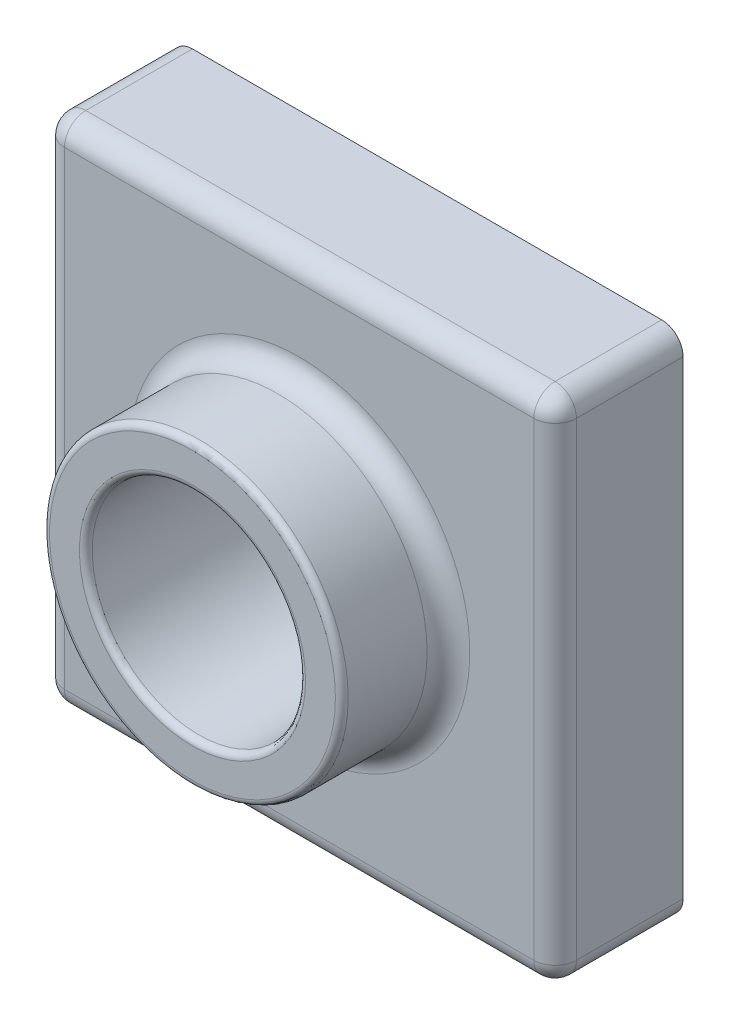
ISO-10303-21;
HEADER;
FILE_DESCRIPTION(('STEP AP214'),'2;1');
FILE_NAME('part.step','',(''),(''),'','','');
FILE_SCHEMA(('AUTOMOTIVE_DESIGN { 1 0 10303 214 1 1 1 1 }'));
ENDSEC;
DATA;
#1=APPLICATION_CONTEXT('core data for automotive mechanical design processes');
#2=APPLICATION_PROTOCOL_DEFINITION('international standard','automotive_design',2000,#1);
#3=PRODUCT_CONTEXT('',#1,'mechanical');
#4=PRODUCT('Part','Part','',(#3));
#5=PRODUCT_RELATED_PRODUCT_CATEGORY('part','',(#4));
#6=PRODUCT_DEFINITION_FORMATION('','',#4);
#7=PRODUCT_DEFINITION_CONTEXT('part definition',#1,'design');
#8=PRODUCT_DEFINITION('design','',#6,#7);
#9=PRODUCT_DEFINITION_SHAPE('','',#8);
#10=(LENGTH_UNIT() NAMED_UNIT(*) SI_UNIT(.MILLI.,.METRE.));
#11=(NAMED_UNIT(*) PLANE_ANGLE_UNIT() SI_UNIT($,.RADIAN.));
#12=(NAMED_UNIT(*) SI_UNIT($,.STERADIAN.) SOLID_ANGLE_UNIT());
#13=UNCERTAINTY_MEASURE_WITH_UNIT(LENGTH_MEASURE(1.E-05),#10,'distance_accuracy_value','');
#14=(GEOMETRIC_REPRESENTATION_CONTEXT(3) GLOBAL_UNCERTAINTY_ASSIGNED_CONTEXT((#13)) GLOBAL_UNIT_ASSIGNED_CONTEXT((#10,
#11,#12)) REPRESENTATION_CONTEXT('',''));
#15=CARTESIAN_POINT('',(0.,0.,0.));
#16=DIRECTION('',(0.,0.,1.));
#17=DIRECTION('',(1.,0.,0.));
#18=AXIS2_PLACEMENT_3D('',#15,#16,#17);
#19=CARTESIAN_POINT('',(0.,0.,0.));
#20=DIRECTION('',(0.,0.,-1.));
#21=DIRECTION('',(-1.,0.,0.));
#22=AXIS2_PLACEMENT_3D('',#19,#20,#21);
#23=PLANE('',#22);
#24=DIRECTION('',(1.,0.,0.));
#25=VECTOR('',#24,1.);
#26=CARTESIAN_POINT('',(-60.,-60.,0.));
#27=LINE('',#26,#25);
#28=CARTESIAN_POINT('',(-55.,-60.,0.));
#29=VERTEX_POINT('',#28);
#30=CARTESIAN_POINT('',(55.,-60.,0.));
#31=VERTEX_POINT('',#30);
#32=EDGE_CURVE('E256',#29,#31,#27,.T.);
#33=ORIENTED_EDGE('',*,*,#32,.F.);
#34=CARTESIAN_POINT('',(-55.,-55.,0.));
#35=DIRECTION('',(0.,0.,-1.));
#36=DIRECTION('',(-1.,0.,0.));
#37=AXIS2_PLACEMENT_3D('',#34,#35,#36);
#38=CIRCLE('',#37,5.);
#39=CARTESIAN_POINT('',(-60.,-55.,0.));
#40=VERTEX_POINT('',#39);
#41=EDGE_CURVE('E304',#29,#40,#38,.T.);
#42=ORIENTED_EDGE('',*,*,#41,.T.);
#43=DIRECTION('',(0.,-1.,0.));
#44=VECTOR('',#43,1.);
#45=CARTESIAN_POINT('',(-60.,-60.,0.));
#46=LINE('',#45,#44);
#47=CARTESIAN_POINT('',(-60.,55.,0.));
#48=VERTEX_POINT('',#47);
#49=EDGE_CURVE('E253',#48,#40,#46,.T.);
#50=ORIENTED_EDGE('',*,*,#49,.F.);
#51=CARTESIAN_POINT('',(-55.,55.,0.));
#52=DIRECTION('',(0.,0.,-1.));
#53=DIRECTION('',(-1.,0.,0.));
#54=AXIS2_PLACEMENT_3D('',#51,#52,#53);
#55=CIRCLE('',#54,5.);
#56=CARTESIAN_POINT('',(-55.,60.,0.));
#57=VERTEX_POINT('',#56);
#58=EDGE_CURVE('E298',#48,#57,#55,.T.);
#59=ORIENTED_EDGE('',*,*,#58,.T.);
#60=DIRECTION('',(-1.,0.,0.));
#61=VECTOR('',#60,1.);
#62=CARTESIAN_POINT('',(-60.,60.,0.));
#63=LINE('',#62,#61);
#64=CARTESIAN_POINT('',(55.,60.,0.));
#65=VERTEX_POINT('',#64);
#66=EDGE_CURVE('E250',#65,#57,#63,.T.);
#67=ORIENTED_EDGE('',*,*,#66,.F.);
#68=CARTESIAN_POINT('',(55.,55.,0.));
#69=DIRECTION('',(0.,0.,-1.));
#70=DIRECTION('',(-1.,0.,0.));
#71=AXIS2_PLACEMENT_3D('',#68,#69,#70);
#72=CIRCLE('',#71,5.);
#73=CARTESIAN_POINT('',(60.,55.,0.));
#74=VERTEX_POINT('',#73);
#75=EDGE_CURVE('E300',#65,#74,#72,.T.);
#76=ORIENTED_EDGE('',*,*,#75,.T.);
#77=DIRECTION('',(0.,1.,0.));
#78=VECTOR('',#77,1.);
#79=CARTESIAN_POINT('',(60.,-60.,0.));
#80=LINE('',#79,#78);
#81=CARTESIAN_POINT('',(60.,-55.,0.));
#82=VERTEX_POINT('',#81);
#83=EDGE_CURVE('E246',#82,#74,#80,.T.);
#84=ORIENTED_EDGE('',*,*,#83,.F.);
#85=CARTESIAN_POINT('',(55.,-55.,0.));
#86=DIRECTION('',(0.,0.,-1.));
#87=DIRECTION('',(-1.,0.,0.));
#88=AXIS2_PLACEMENT_3D('',#85,#86,#87);
#89=CIRCLE('',#88,5.);
#90=EDGE_CURVE('E302',#82,#31,#89,.T.);
#91=ORIENTED_EDGE('',*,*,#90,.T.);
#92=EDGE_LOOP('',(#33,#42,#50,#59,#67,#76,#84,#91));
#93=FACE_BOUND('',#92,.T.);
#94=CARTESIAN_POINT('',(-55.,-55.,0.));
#95=DIRECTION('',(0.,0.,-1.));
#96=DIRECTION('',(-1.,0.,0.));
#97=AXIS2_PLACEMENT_3D('',#94,#95,#96);
#98=CIRCLE('',#97,3.);
#99=CARTESIAN_POINT('',(-55.,-58.,0.));
#100=VERTEX_POINT('',#99);
#101=CARTESIAN_POINT('',(-58.,-55.,0.));
#102=VERTEX_POINT('',#101);
#103=EDGE_CURVE('E225',#100,#102,#98,.T.);
#104=ORIENTED_EDGE('',*,*,#103,.F.);
#105=DIRECTION('',(1.,0.,0.));
#106=VECTOR('',#105,1.);
#107=CARTESIAN_POINT('',(0.,-58.,0.));
#108=LINE('',#107,#106);
#109=CARTESIAN_POINT('',(55.,-58.,0.));
#110=VERTEX_POINT('',#109);
#111=EDGE_CURVE('E227',#100,#110,#108,.T.);
#112=ORIENTED_EDGE('',*,*,#111,.T.);
#113=CARTESIAN_POINT('',(55.,-55.,0.));
#114=DIRECTION('',(0.,0.,-1.));
#115=DIRECTION('',(-1.,0.,0.));
#116=AXIS2_PLACEMENT_3D('',#113,#114,#115);
#117=CIRCLE('',#116,3.);
#118=CARTESIAN_POINT('',(58.,-55.,0.));
#119=VERTEX_POINT('',#118);
#120=EDGE_CURVE('E223',#119,#110,#117,.T.);
#121=ORIENTED_EDGE('',*,*,#120,.F.);
#122=DIRECTION('',(0.,1.,0.));
#123=VECTOR('',#122,1.);
#124=CARTESIAN_POINT('',(58.,0.,0.));
#125=LINE('',#124,#123);
#126=CARTESIAN_POINT('',(58.,55.,0.));
#127=VERTEX_POINT('',#126);
#128=EDGE_CURVE('E48',#119,#127,#125,.T.);
#129=ORIENTED_EDGE('',*,*,#128,.T.);
#130=CARTESIAN_POINT('',(55.,55.,0.));
#131=DIRECTION('',(0.,0.,-1.));
#132=DIRECTION('',(-1.,0.,0.));
#133=AXIS2_PLACEMENT_3D('',#130,#131,#132);
#134=CIRCLE('',#133,3.);
#135=CARTESIAN_POINT('',(55.,58.,0.));
#136=VERTEX_POINT('',#135);
#137=EDGE_CURVE('E226',#136,#127,#134,.T.);
#138=ORIENTED_EDGE('',*,*,#137,.F.);
#139=DIRECTION('',(-1.,0.,0.));
#140=VECTOR('',#139,1.);
#141=CARTESIAN_POINT('',(0.,58.,0.));
#142=LINE('',#141,#140);
#143=CARTESIAN_POINT('',(-55.,58.,0.));
#144=VERTEX_POINT('',#143);
#145=EDGE_CURVE('E221',#136,#144,#142,.T.);
#146=ORIENTED_EDGE('',*,*,#145,.T.);
#147=CARTESIAN_POINT('',(-55.,55.,0.));
#148=DIRECTION('',(0.,0.,-1.));
#149=DIRECTION('',(-1.,0.,0.));
#150=AXIS2_PLACEMENT_3D('',#147,#148,#149);
#151=CIRCLE('',#150,3.);
#152=CARTESIAN_POINT('',(-58.,55.,0.));
#153=VERTEX_POINT('',#152);
#154=EDGE_CURVE('E187',#153,#144,#151,.T.);
#155=ORIENTED_EDGE('',*,*,#154,.F.);
#156=DIRECTION('',(0.,-1.,0.));
#157=VECTOR('',#156,1.);
#158=CARTESIAN_POINT('',(-58.,0.,0.));
#159=LINE('',#158,#157);
#160=EDGE_CURVE('E231',#153,#102,#159,.T.);
#161=ORIENTED_EDGE('',*,*,#160,.T.);
#162=EDGE_LOOP('',(#104,#112,#121,#129,#138,#146,#155,#161));
#163=FACE_BOUND('',#162,.T.);
#164=ADVANCED_FACE('F33',(#93,#163),#23,.T.);
#165=CARTESIAN_POINT('',(60.,-60.,30.));
#166=DIRECTION('',(-1.,0.,0.));
#167=DIRECTION('',(0.,0.,1.));
#168=AXIS2_PLACEMENT_3D('',#165,#166,#167);
#169=PLANE('',#168);
#170=DIRECTION('',(0.,1.,0.));
#171=VECTOR('',#170,1.);
#172=CARTESIAN_POINT('',(60.,-60.,25.));
#173=LINE('',#172,#171);
#174=CARTESIAN_POINT('',(60.,55.,25.));
#175=VERTEX_POINT('',#174);
#176=CARTESIAN_POINT('',(60.,-55.,25.));
#177=VERTEX_POINT('',#176);
#178=EDGE_CURVE('E56',#175,#177,#173,.F.);
#179=ORIENTED_EDGE('',*,*,#178,.T.);
#180=DIRECTION('',(0.,0.,-1.));
#181=VECTOR('',#180,1.);
#182=CARTESIAN_POINT('',(60.,-55.,30.));
#183=LINE('',#182,#181);
#184=EDGE_CURVE('E296',#177,#82,#183,.T.);
#185=ORIENTED_EDGE('',*,*,#184,.T.);
#186=ORIENTED_EDGE('',*,*,#83,.T.);
#187=DIRECTION('',(0.,0.,-1.));
#188=VECTOR('',#187,1.);
#189=CARTESIAN_POINT('',(60.,55.,30.));
#190=LINE('',#189,#188);
#191=EDGE_CURVE('E293',#74,#175,#190,.F.);
#192=ORIENTED_EDGE('',*,*,#191,.T.);
#193=EDGE_LOOP('',(#179,#185,#186,#192));
#194=FACE_BOUND('',#193,.T.);
#195=ADVANCED_FACE('F390',(#194),#169,.F.);
#196=CARTESIAN_POINT('',(-60.,60.,30.));
#197=DIRECTION('',(0.,-1.,0.));
#198=DIRECTION('',(0.,0.,-1.));
#199=AXIS2_PLACEMENT_3D('',#196,#197,#198);
#200=PLANE('',#199);
#201=DIRECTION('',(-1.,0.,0.));
#202=VECTOR('',#201,1.);
#203=CARTESIAN_POINT('',(-60.,60.,25.));
#204=LINE('',#203,#202);
#205=CARTESIAN_POINT('',(-55.,60.,25.));
#206=VERTEX_POINT('',#205);
#207=CARTESIAN_POINT('',(55.,60.,25.));
#208=VERTEX_POINT('',#207);
#209=EDGE_CURVE('E289',#206,#208,#204,.F.);
#210=ORIENTED_EDGE('',*,*,#209,.T.);
#211=DIRECTION('',(0.,0.,-1.));
#212=VECTOR('',#211,1.);
#213=CARTESIAN_POINT('',(55.,60.,30.));
#214=LINE('',#213,#212);
#215=EDGE_CURVE('E291',#208,#65,#214,.T.);
#216=ORIENTED_EDGE('',*,*,#215,.T.);
#217=ORIENTED_EDGE('',*,*,#66,.T.);
#218=DIRECTION('',(0.,0.,-1.));
#219=VECTOR('',#218,1.);
#220=CARTESIAN_POINT('',(-55.,60.,30.));
#221=LINE('',#220,#219);
#222=EDGE_CURVE('E287',#57,#206,#221,.F.);
#223=ORIENTED_EDGE('',*,*,#222,.T.);
#224=EDGE_LOOP('',(#210,#216,#217,#223));
#225=FACE_BOUND('',#224,.T.);
#226=ADVANCED_FACE('F395',(#225),#200,.F.);
#227=CARTESIAN_POINT('',(-60.,-60.,30.));
#228=DIRECTION('',(1.,0.,0.));
#229=DIRECTION('',(0.,0.,-1.));
#230=AXIS2_PLACEMENT_3D('',#227,#228,#229);
#231=PLANE('',#230);
#232=ORIENTED_EDGE('',*,*,#49,.T.);
#233=DIRECTION('',(0.,0.,-1.));
#234=VECTOR('',#233,1.);
#235=CARTESIAN_POINT('',(-60.,-55.,30.));
#236=LINE('',#235,#234);
#237=CARTESIAN_POINT('',(-60.,-55.,25.));
#238=VERTEX_POINT('',#237);
#239=EDGE_CURVE('E285',#40,#238,#236,.F.);
#240=ORIENTED_EDGE('',*,*,#239,.T.);
#241=DIRECTION('',(0.,-1.,0.));
#242=VECTOR('',#241,1.);
#243=CARTESIAN_POINT('',(-60.,-60.,25.));
#244=LINE('',#243,#242);
#245=CARTESIAN_POINT('',(-60.,55.,25.));
#246=VERTEX_POINT('',#245);
#247=EDGE_CURVE('E283',#238,#246,#244,.F.);
#248=ORIENTED_EDGE('',*,*,#247,.T.);
#249=DIRECTION('',(0.,0.,-1.));
#250=VECTOR('',#249,1.);
#251=CARTESIAN_POINT('',(-60.,55.,30.));
#252=LINE('',#251,#250);
#253=EDGE_CURVE('E281',#246,#48,#252,.T.);
#254=ORIENTED_EDGE('',*,*,#253,.T.);
#255=EDGE_LOOP('',(#232,#240,#248,#254));
#256=FACE_BOUND('',#255,.T.);
#257=ADVANCED_FACE('F812',(#256),#231,.F.);
#258=CARTESIAN_POINT('',(-60.,-60.,30.));
#259=DIRECTION('',(0.,1.,0.));
#260=DIRECTION('',(0.,0.,1.));
#261=AXIS2_PLACEMENT_3D('',#258,#259,#260);
#262=PLANE('',#261);
#263=DIRECTION('',(1.,0.,0.));
#264=VECTOR('',#263,1.);
#265=CARTESIAN_POINT('',(-60.,-60.,25.));
#266=LINE('',#265,#264);
#267=CARTESIAN_POINT('',(55.,-60.,25.));
#268=VERTEX_POINT('',#267);
#269=CARTESIAN_POINT('',(-55.,-60.,25.));
#270=VERTEX_POINT('',#269);
#271=EDGE_CURVE('E276',#268,#270,#266,.F.);
#272=ORIENTED_EDGE('',*,*,#271,.T.);
#273=DIRECTION('',(0.,0.,-1.));
#274=VECTOR('',#273,1.);
#275=CARTESIAN_POINT('',(-55.,-60.,30.));
#276=LINE('',#275,#274);
#277=EDGE_CURVE('E279',#270,#29,#276,.T.);
#278=ORIENTED_EDGE('',*,*,#277,.T.);
#279=ORIENTED_EDGE('',*,*,#32,.T.);
#280=DIRECTION('',(0.,0.,-1.));
#281=VECTOR('',#280,1.);
#282=CARTESIAN_POINT('',(55.,-60.,30.));
#283=LINE('',#282,#281);
#284=EDGE_CURVE('E274',#31,#268,#283,.F.);
#285=ORIENTED_EDGE('',*,*,#284,.T.);
#286=EDGE_LOOP('',(#272,#278,#279,#285));
#287=FACE_BOUND('',#286,.T.);
#288=ADVANCED_FACE('F384',(#287),#262,.F.);
#289=CARTESIAN_POINT('',(0.,0.,30.));
#290=DIRECTION('',(0.,0.,-1.));
#291=DIRECTION('',(-1.,0.,0.));
#292=AXIS2_PLACEMENT_3D('',#289,#290,#291);
#293=PLANE('',#292);
#294=CARTESIAN_POINT('',(0.,0.,30.));
#295=DIRECTION('',(0.,0.,-1.));
#296=DIRECTION('',(-1.,0.,0.));
#297=AXIS2_PLACEMENT_3D('',#294,#295,#296);
#298=CIRCLE('',#297,40.);
#299=CARTESIAN_POINT('',(-40.,0.,30.));
#300=VERTEX_POINT('',#299);
#301=EDGE_CURVE('E271',#300,#300,#298,.T.);
#302=ORIENTED_EDGE('',*,*,#301,.T.);
#303=EDGE_LOOP('',(#302));
#304=FACE_BOUND('',#303,.T.);
#305=DIRECTION('',(0.,-1.,0.));
#306=VECTOR('',#305,1.);
#307=CARTESIAN_POINT('',(-55.,0.,30.));
#308=LINE('',#307,#306);
#309=CARTESIAN_POINT('',(-55.,55.,30.));
#310=VERTEX_POINT('',#309);
#311=CARTESIAN_POINT('',(-55.,-55.,30.));
#312=VERTEX_POINT('',#311);
#313=EDGE_CURVE('E266',#310,#312,#308,.T.);
#314=ORIENTED_EDGE('',*,*,#313,.T.);
#315=DIRECTION('',(1.,0.,0.));
#316=VECTOR('',#315,1.);
#317=CARTESIAN_POINT('',(0.,-55.,30.));
#318=LINE('',#317,#316);
#319=CARTESIAN_POINT('',(55.,-55.,30.));
#320=VERTEX_POINT('',#319);
#321=EDGE_CURVE('E268',#312,#320,#318,.T.);
#322=ORIENTED_EDGE('',*,*,#321,.T.);
#323=DIRECTION('',(0.,1.,0.));
#324=VECTOR('',#323,1.);
#325=CARTESIAN_POINT('',(55.,0.,30.));
#326=LINE('',#325,#324);
#327=CARTESIAN_POINT('',(55.,55.,30.));
#328=VERTEX_POINT('',#327);
#329=EDGE_CURVE('E262',#320,#328,#326,.T.);
#330=ORIENTED_EDGE('',*,*,#329,.T.);
#331=DIRECTION('',(-1.,0.,0.));
#332=VECTOR('',#331,1.);
#333=CARTESIAN_POINT('',(0.,55.,30.));
#334=LINE('',#333,#332);
#335=EDGE_CURVE('E264',#328,#310,#334,.T.);
#336=ORIENTED_EDGE('',*,*,#335,.T.);
#337=EDGE_LOOP('',(#314,#322,#330,#336));
#338=FACE_BOUND('',#337,.T.);
#339=ADVANCED_FACE('F376',(#304,#338),#293,.F.);
#340=CARTESIAN_POINT('',(0.,0.,0.));
#341=DIRECTION('',(0.,0.,-1.));
#342=DIRECTION('',(-1.,0.,0.));
#343=AXIS2_PLACEMENT_3D('',#340,#341,#342);
#344=CIRCLE('',#343,27.);
#345=CARTESIAN_POINT('',(-27.,0.,0.));
#346=VERTEX_POINT('',#345);
#347=EDGE_CURVE('E222',#346,#346,#344,.F.);
#348=ORIENTED_EDGE('',*,*,#347,.F.);
#349=EDGE_LOOP('',(#348));
#350=FACE_BOUND('',#349,.T.);
#351=CARTESIAN_POINT('',(0.,0.,0.));
#352=DIRECTION('',(0.,0.,1.));
#353=DIRECTION('',(1.,0.,0.));
#354=AXIS2_PLACEMENT_3D('',#351,#352,#353);
#355=CIRCLE('',#354,25.);
#356=CARTESIAN_POINT('',(25.,0.,0.));
#357=VERTEX_POINT('',#356);
#358=EDGE_CURVE('E243',#357,#357,#355,.T.);
#359=ORIENTED_EDGE('',*,*,#358,.T.);
#360=EDGE_LOOP('',(#359));
#361=FACE_BOUND('',#360,.T.);
#362=ADVANCED_FACE('F374',(#350,#361),#23,.T.);
#363=CARTESIAN_POINT('',(0.,0.,55.));
#364=DIRECTION('',(0.,0.,-1.));
#365=DIRECTION('',(-1.,0.,0.));
#366=AXIS2_PLACEMENT_3D('',#363,#364,#365);
#367=CYLINDRICAL_SURFACE('',#366,35.);
#368=CARTESIAN_POINT('',(0.,0.,53.5));
#369=DIRECTION('',(0.,0.,1.));
#370=DIRECTION('',(1.,0.,0.));
#371=AXIS2_PLACEMENT_3D('',#368,#369,#370);
#372=CIRCLE('',#371,35.);
#373=CARTESIAN_POINT('',(35.,0.,53.5));
#374=VERTEX_POINT('',#373);
#375=EDGE_CURVE('E41',#374,#374,#372,.F.);
#376=ORIENTED_EDGE('',*,*,#375,.T.);
#377=EDGE_LOOP('',(#376));
#378=FACE_BOUND('',#377,.T.);
#379=CARTESIAN_POINT('',(0.,0.,35.));
#380=DIRECTION('',(0.,0.,-1.));
#381=DIRECTION('',(-1.,0.,0.));
#382=AXIS2_PLACEMENT_3D('',#379,#380,#381);
#383=CIRCLE('',#382,35.);
#384=CARTESIAN_POINT('',(-35.,0.,35.));
#385=VERTEX_POINT('',#384);
#386=EDGE_CURVE('E259',#385,#385,#383,.F.);
#387=ORIENTED_EDGE('',*,*,#386,.T.);
#388=EDGE_LOOP('',(#387));
#389=FACE_BOUND('',#388,.T.);
#390=ADVANCED_FACE('F348',(#378,#389),#367,.T.);
#391=CARTESIAN_POINT('',(0.,0.,55.));
#392=DIRECTION('',(0.,0.,1.));
#393=DIRECTION('',(1.,0.,0.));
#394=AXIS2_PLACEMENT_3D('',#391,#392,#393);
#395=PLANE('',#394);
#396=CARTESIAN_POINT('',(0.,0.,55.));
#397=DIRECTION('',(0.,0.,1.));
#398=DIRECTION('',(1.,0.,0.));
#399=AXIS2_PLACEMENT_3D('',#396,#397,#398);
#400=CIRCLE('',#399,33.5);
#401=CARTESIAN_POINT('',(33.5,0.,55.));
#402=VERTEX_POINT('',#401);
#403=EDGE_CURVE('E343',#402,#402,#400,.T.);
#404=ORIENTED_EDGE('',*,*,#403,.T.);
#405=EDGE_LOOP('',(#404));
#406=FACE_BOUND('',#405,.T.);
#407=CARTESIAN_POINT('',(0.,0.,55.));
#408=DIRECTION('',(0.,0.,1.));
#409=DIRECTION('',(1.,0.,0.));
#410=AXIS2_PLACEMENT_3D('',#407,#408,#409);
#411=CIRCLE('',#410,26.5);
#412=CARTESIAN_POINT('',(26.5,0.,55.));
#413=VERTEX_POINT('',#412);
#414=EDGE_CURVE('E306',#413,#413,#411,.F.);
#415=ORIENTED_EDGE('',*,*,#414,.T.);
#416=EDGE_LOOP('',(#415));
#417=FACE_BOUND('',#416,.T.);
#418=ADVANCED_FACE('F357',(#406,#417),#395,.T.);
#419=CARTESIAN_POINT('',(0.,0.,0.));
#420=DIRECTION('',(0.,0.,1.));
#421=DIRECTION('',(1.,0.,0.));
#422=AXIS2_PLACEMENT_3D('',#419,#420,#421);
#423=CYLINDRICAL_SURFACE('',#422,25.);
#424=CARTESIAN_POINT('',(0.,0.,53.5));
#425=DIRECTION('',(0.,0.,1.));
#426=DIRECTION('',(1.,0.,0.));
#427=AXIS2_PLACEMENT_3D('',#424,#425,#426);
#428=CIRCLE('',#427,25.);
#429=CARTESIAN_POINT('',(25.,0.,53.5));
#430=VERTEX_POINT('',#429);
#431=EDGE_CURVE('E11',#430,#430,#428,.T.);
#432=ORIENTED_EDGE('',*,*,#431,.T.);
#433=EDGE_LOOP('',(#432));
#434=FACE_BOUND('',#433,.T.);
#435=ORIENTED_EDGE('',*,*,#358,.F.);
#436=EDGE_LOOP('',(#435));
#437=FACE_BOUND('',#436,.T.);
#438=ADVANCED_FACE('F360',(#434,#437),#423,.F.);
#439=CARTESIAN_POINT('',(0.,0.,35.));
#440=DIRECTION('',(0.,0.,-1.));
#441=DIRECTION('',(-1.,0.,0.));
#442=AXIS2_PLACEMENT_3D('',#439,#440,#441);
#443=TOROIDAL_SURFACE('',#442,40.,5.);
#444=ORIENTED_EDGE('',*,*,#301,.F.);
#445=EDGE_LOOP('',(#444));
#446=FACE_BOUND('',#445,.T.);
#447=ORIENTED_EDGE('',*,*,#386,.F.);
#448=EDGE_LOOP('',(#447));
#449=FACE_BOUND('',#448,.T.);
#450=ADVANCED_FACE('F370',(#446,#449),#443,.F.);
#451=CARTESIAN_POINT('',(-55.,55.,30.));
#452=DIRECTION('',(0.,0.,-1.));
#453=DIRECTION('',(-1.,0.,0.));
#454=AXIS2_PLACEMENT_3D('',#451,#452,#453);
#455=CYLINDRICAL_SURFACE('',#454,5.);
#456=ORIENTED_EDGE('',*,*,#58,.F.);
#457=ORIENTED_EDGE('',*,*,#253,.F.);
#458=CARTESIAN_POINT('',(-55.,55.,25.));
#459=DIRECTION('',(0.,0.,1.));
#460=DIRECTION('',(1.,0.,0.));
#461=AXIS2_PLACEMENT_3D('',#458,#459,#460);
#462=CIRCLE('',#461,5.);
#463=EDGE_CURVE('E247',#206,#246,#462,.T.);
#464=ORIENTED_EDGE('',*,*,#463,.F.);
#465=ORIENTED_EDGE('',*,*,#222,.F.);
#466=EDGE_LOOP('',(#456,#457,#464,#465));
#467=FACE_BOUND('',#466,.T.);
#468=ADVANCED_FACE('F781',(#467),#455,.T.);
#469=CARTESIAN_POINT('',(0.,55.,25.));
#470=DIRECTION('',(-1.,0.,0.));
#471=DIRECTION('',(0.,0.,1.));
#472=AXIS2_PLACEMENT_3D('',#469,#470,#471);
#473=CYLINDRICAL_SURFACE('',#472,5.);
#474=CARTESIAN_POINT('',(55.,55.,25.));
#475=DIRECTION('',(1.,0.,0.));
#476=DIRECTION('',(0.,0.,-1.));
#477=AXIS2_PLACEMENT_3D('',#474,#475,#476);
#478=CIRCLE('',#477,5.);
#479=EDGE_CURVE('E333',#208,#328,#478,.T.);
#480=ORIENTED_EDGE('',*,*,#479,.F.);
#481=ORIENTED_EDGE('',*,*,#209,.F.);
#482=CARTESIAN_POINT('',(-55.,55.,25.));
#483=DIRECTION('',(-1.,0.,0.));
#484=DIRECTION('',(0.,0.,1.));
#485=AXIS2_PLACEMENT_3D('',#482,#483,#484);
#486=CIRCLE('',#485,5.);
#487=EDGE_CURVE('E336',#310,#206,#486,.T.);
#488=ORIENTED_EDGE('',*,*,#487,.F.);
#489=ORIENTED_EDGE('',*,*,#335,.F.);
#490=EDGE_LOOP('',(#480,#481,#488,#489));
#491=FACE_BOUND('',#490,.T.);
#492=ADVANCED_FACE('F771',(#491),#473,.T.);
#493=CARTESIAN_POINT('',(55.,55.,30.));
#494=DIRECTION('',(0.,0.,-1.));
#495=DIRECTION('',(-1.,0.,0.));
#496=AXIS2_PLACEMENT_3D('',#493,#494,#495);
#497=CYLINDRICAL_SURFACE('',#496,5.);
#498=ORIENTED_EDGE('',*,*,#75,.F.);
#499=ORIENTED_EDGE('',*,*,#215,.F.);
#500=CARTESIAN_POINT('',(55.,55.,25.));
#501=DIRECTION('',(0.,0.,1.));
#502=DIRECTION('',(1.,0.,0.));
#503=AXIS2_PLACEMENT_3D('',#500,#501,#502);
#504=CIRCLE('',#503,5.);
#505=EDGE_CURVE('E330',#175,#208,#504,.T.);
#506=ORIENTED_EDGE('',*,*,#505,.F.);
#507=ORIENTED_EDGE('',*,*,#191,.F.);
#508=EDGE_LOOP('',(#498,#499,#506,#507));
#509=FACE_BOUND('',#508,.T.);
#510=ADVANCED_FACE('F761',(#509),#497,.T.);
#511=CARTESIAN_POINT('',(-55.,55.,25.));
#512=DIRECTION('',(0.,0.,1.));
#513=DIRECTION('',(1.,0.,0.));
#514=AXIS2_PLACEMENT_3D('',#511,#512,#513);
#515=SPHERICAL_SURFACE('',#514,5.);
#516=ORIENTED_EDGE('',*,*,#487,.T.);
#517=ORIENTED_EDGE('',*,*,#463,.T.);
#518=CARTESIAN_POINT('',(-55.,55.,25.));
#519=DIRECTION('',(0.,1.,0.));
#520=DIRECTION('',(0.,0.,1.));
#521=AXIS2_PLACEMENT_3D('',#518,#519,#520);
#522=CIRCLE('',#521,5.);
#523=EDGE_CURVE('E327',#310,#246,#522,.F.);
#524=ORIENTED_EDGE('',*,*,#523,.F.);
#525=EDGE_LOOP('',(#516,#517,#524));
#526=FACE_BOUND('',#525,.T.);
#527=ADVANCED_FACE('F751',(#526),#515,.T.);
#528=CARTESIAN_POINT('',(55.,55.,25.));
#529=DIRECTION('',(0.,0.,1.));
#530=DIRECTION('',(1.,0.,0.));
#531=AXIS2_PLACEMENT_3D('',#528,#529,#530);
#532=SPHERICAL_SURFACE('',#531,5.);
#533=ORIENTED_EDGE('',*,*,#505,.T.);
#534=ORIENTED_EDGE('',*,*,#479,.T.);
#535=CARTESIAN_POINT('',(55.,55.,25.));
#536=DIRECTION('',(0.,1.,0.));
#537=DIRECTION('',(0.,0.,1.));
#538=AXIS2_PLACEMENT_3D('',#535,#536,#537);
#539=CIRCLE('',#538,5.);
#540=EDGE_CURVE('E324',#175,#328,#539,.F.);
#541=ORIENTED_EDGE('',*,*,#540,.F.);
#542=EDGE_LOOP('',(#533,#534,#541));
#543=FACE_BOUND('',#542,.T.);
#544=ADVANCED_FACE('F741',(#543),#532,.T.);
#545=CARTESIAN_POINT('',(-55.,-55.,30.));
#546=DIRECTION('',(0.,0.,-1.));
#547=DIRECTION('',(-1.,0.,0.));
#548=AXIS2_PLACEMENT_3D('',#545,#546,#547);
#549=CYLINDRICAL_SURFACE('',#548,5.);
#550=ORIENTED_EDGE('',*,*,#41,.F.);
#551=ORIENTED_EDGE('',*,*,#277,.F.);
#552=CARTESIAN_POINT('',(-55.,-55.,25.));
#553=DIRECTION('',(0.,0.,1.));
#554=DIRECTION('',(1.,0.,0.));
#555=AXIS2_PLACEMENT_3D('',#552,#553,#554);
#556=CIRCLE('',#555,5.);
#557=EDGE_CURVE('E321',#238,#270,#556,.T.);
#558=ORIENTED_EDGE('',*,*,#557,.F.);
#559=ORIENTED_EDGE('',*,*,#239,.F.);
#560=EDGE_LOOP('',(#550,#551,#558,#559));
#561=FACE_BOUND('',#560,.T.);
#562=ADVANCED_FACE('F731',(#561),#549,.T.);
#563=CARTESIAN_POINT('',(-55.,0.,25.));
#564=DIRECTION('',(0.,-1.,0.));
#565=DIRECTION('',(0.,0.,-1.));
#566=AXIS2_PLACEMENT_3D('',#563,#564,#565);
#567=CYLINDRICAL_SURFACE('',#566,5.);
#568=ORIENTED_EDGE('',*,*,#523,.T.);
#569=ORIENTED_EDGE('',*,*,#247,.F.);
#570=CARTESIAN_POINT('',(-55.,-55.,25.));
#571=DIRECTION('',(0.,-1.,0.));
#572=DIRECTION('',(0.,0.,-1.));
#573=AXIS2_PLACEMENT_3D('',#570,#571,#572);
#574=CIRCLE('',#573,5.);
#575=EDGE_CURVE('E318',#312,#238,#574,.T.);
#576=ORIENTED_EDGE('',*,*,#575,.F.);
#577=ORIENTED_EDGE('',*,*,#313,.F.);
#578=EDGE_LOOP('',(#568,#569,#576,#577));
#579=FACE_BOUND('',#578,.T.);
#580=ADVANCED_FACE('F721',(#579),#567,.T.);
#581=CARTESIAN_POINT('',(55.,0.,25.));
#582=DIRECTION('',(0.,1.,0.));
#583=DIRECTION('',(0.,0.,1.));
#584=AXIS2_PLACEMENT_3D('',#581,#582,#583);
#585=CYLINDRICAL_SURFACE('',#584,5.);
#586=ORIENTED_EDGE('',*,*,#540,.T.);
#587=ORIENTED_EDGE('',*,*,#329,.F.);
#588=CARTESIAN_POINT('',(55.,-55.,25.));
#589=DIRECTION('',(0.,-1.,0.));
#590=DIRECTION('',(0.,0.,-1.));
#591=AXIS2_PLACEMENT_3D('',#588,#589,#590);
#592=CIRCLE('',#591,5.);
#593=EDGE_CURVE('E315',#177,#320,#592,.T.);
#594=ORIENTED_EDGE('',*,*,#593,.F.);
#595=ORIENTED_EDGE('',*,*,#178,.F.);
#596=EDGE_LOOP('',(#586,#587,#594,#595));
#597=FACE_BOUND('',#596,.T.);
#598=ADVANCED_FACE('F711',(#597),#585,.T.);
#599=CARTESIAN_POINT('',(55.,-55.,30.));
#600=DIRECTION('',(0.,0.,-1.));
#601=DIRECTION('',(-1.,0.,0.));
#602=AXIS2_PLACEMENT_3D('',#599,#600,#601);
#603=CYLINDRICAL_SURFACE('',#602,5.);
#604=ORIENTED_EDGE('',*,*,#90,.F.);
#605=ORIENTED_EDGE('',*,*,#184,.F.);
#606=CARTESIAN_POINT('',(55.,-55.,25.));
#607=DIRECTION('',(0.,0.,1.));
#608=DIRECTION('',(1.,0.,0.));
#609=AXIS2_PLACEMENT_3D('',#606,#607,#608);
#610=CIRCLE('',#609,5.);
#611=EDGE_CURVE('E312',#268,#177,#610,.T.);
#612=ORIENTED_EDGE('',*,*,#611,.F.);
#613=ORIENTED_EDGE('',*,*,#284,.F.);
#614=EDGE_LOOP('',(#604,#605,#612,#613));
#615=FACE_BOUND('',#614,.T.);
#616=ADVANCED_FACE('F701',(#615),#603,.T.);
#617=CARTESIAN_POINT('',(-55.,-55.,25.));
#618=DIRECTION('',(0.,0.,1.));
#619=DIRECTION('',(1.,0.,0.));
#620=AXIS2_PLACEMENT_3D('',#617,#618,#619);
#621=SPHERICAL_SURFACE('',#620,5.);
#622=ORIENTED_EDGE('',*,*,#575,.T.);
#623=ORIENTED_EDGE('',*,*,#557,.T.);
#624=CARTESIAN_POINT('',(-55.,-55.,25.));
#625=DIRECTION('',(-1.,0.,0.));
#626=DIRECTION('',(0.,0.,1.));
#627=AXIS2_PLACEMENT_3D('',#624,#625,#626);
#628=CIRCLE('',#627,5.);
#629=EDGE_CURVE('E309',#312,#270,#628,.F.);
#630=ORIENTED_EDGE('',*,*,#629,.F.);
#631=EDGE_LOOP('',(#622,#623,#630));
#632=FACE_BOUND('',#631,.T.);
#633=ADVANCED_FACE('F691',(#632),#621,.T.);
#634=CARTESIAN_POINT('',(55.,-55.,25.));
#635=DIRECTION('',(0.,0.,1.));
#636=DIRECTION('',(1.,0.,0.));
#637=AXIS2_PLACEMENT_3D('',#634,#635,#636);
#638=SPHERICAL_SURFACE('',#637,5.);
#639=ORIENTED_EDGE('',*,*,#611,.T.);
#640=ORIENTED_EDGE('',*,*,#593,.T.);
#641=CARTESIAN_POINT('',(55.,-55.,25.));
#642=DIRECTION('',(1.,0.,0.));
#643=DIRECTION('',(0.,0.,-1.));
#644=AXIS2_PLACEMENT_3D('',#641,#642,#643);
#645=CIRCLE('',#644,5.);
#646=EDGE_CURVE('E307',#268,#320,#645,.F.);
#647=ORIENTED_EDGE('',*,*,#646,.F.);
#648=EDGE_LOOP('',(#639,#640,#647));
#649=FACE_BOUND('',#648,.T.);
#650=ADVANCED_FACE('F681',(#649),#638,.T.);
#651=CARTESIAN_POINT('',(0.,-55.,25.));
#652=DIRECTION('',(1.,0.,0.));
#653=DIRECTION('',(0.,0.,-1.));
#654=AXIS2_PLACEMENT_3D('',#651,#652,#653);
#655=CYLINDRICAL_SURFACE('',#654,5.);
#656=ORIENTED_EDGE('',*,*,#629,.T.);
#657=ORIENTED_EDGE('',*,*,#271,.F.);
#658=ORIENTED_EDGE('',*,*,#646,.T.);
#659=ORIENTED_EDGE('',*,*,#321,.F.);
#660=EDGE_LOOP('',(#656,#657,#658,#659));
#661=FACE_BOUND('',#660,.T.);
#662=ADVANCED_FACE('F354',(#661),#655,.T.);
#663=CARTESIAN_POINT('',(0.,0.,53.5));
#664=DIRECTION('',(0.,0.,1.));
#665=DIRECTION('',(1.,0.,0.));
#666=AXIS2_PLACEMENT_3D('',#663,#664,#665);
#667=TOROIDAL_SURFACE('',#666,33.5,1.5);
#668=ORIENTED_EDGE('',*,*,#375,.F.);
#669=EDGE_LOOP('',(#668));
#670=FACE_BOUND('',#669,.T.);
#671=ORIENTED_EDGE('',*,*,#403,.F.);
#672=EDGE_LOOP('',(#671));
#673=FACE_BOUND('',#672,.T.);
#674=ADVANCED_FACE('F351',(#670,#673),#667,.T.);
#675=CARTESIAN_POINT('',(0.,0.,53.5));
#676=DIRECTION('',(0.,0.,1.));
#677=DIRECTION('',(1.,0.,0.));
#678=AXIS2_PLACEMENT_3D('',#675,#676,#677);
#679=TOROIDAL_SURFACE('',#678,26.5,1.5);
#680=ORIENTED_EDGE('',*,*,#414,.F.);
#681=EDGE_LOOP('',(#680));
#682=FACE_BOUND('',#681,.T.);
#683=ORIENTED_EDGE('',*,*,#431,.F.);
#684=EDGE_LOOP('',(#683));
#685=FACE_BOUND('',#684,.T.);
#686=ADVANCED_FACE('F35',(#682,#685),#679,.T.);
#687=CARTESIAN_POINT('',(58.,-60.,30.));
#688=DIRECTION('',(-1.,0.,0.));
#689=DIRECTION('',(0.,0.,1.));
#690=AXIS2_PLACEMENT_3D('',#687,#688,#689);
#691=PLANE('',#690);
#692=DIRECTION('',(0.,1.,0.));
#693=VECTOR('',#692,1.);
#694=CARTESIAN_POINT('',(58.,-60.,25.));
#695=LINE('',#694,#693);
#696=CARTESIAN_POINT('',(58.,55.,25.));
#697=VERTEX_POINT('',#696);
#698=CARTESIAN_POINT('',(58.,-55.,25.));
#699=VERTEX_POINT('',#698);
#700=EDGE_CURVE('E173',#697,#699,#695,.F.);
#701=ORIENTED_EDGE('',*,*,#700,.F.);
#702=DIRECTION('',(0.,0.,1.));
#703=VECTOR('',#702,1.);
#704=CARTESIAN_POINT('',(58.,55.,30.));
#705=LINE('',#704,#703);
#706=EDGE_CURVE('E181',#127,#697,#705,.T.);
#707=ORIENTED_EDGE('',*,*,#706,.F.);
#708=ORIENTED_EDGE('',*,*,#128,.F.);
#709=DIRECTION('',(0.,0.,1.));
#710=VECTOR('',#709,1.);
#711=CARTESIAN_POINT('',(58.,-55.,30.));
#712=LINE('',#711,#710);
#713=EDGE_CURVE('E180',#699,#119,#712,.F.);
#714=ORIENTED_EDGE('',*,*,#713,.F.);
#715=EDGE_LOOP('',(#701,#707,#708,#714));
#716=FACE_BOUND('',#715,.T.);
#717=ADVANCED_FACE('F183',(#716),#691,.T.);
#718=CARTESIAN_POINT('',(-60.,58.,30.));
#719=DIRECTION('',(0.,-1.,0.));
#720=DIRECTION('',(0.,0.,-1.));
#721=AXIS2_PLACEMENT_3D('',#718,#719,#720);
#722=PLANE('',#721);
#723=DIRECTION('',(1.,0.,0.));
#724=VECTOR('',#723,1.);
#725=CARTESIAN_POINT('',(-60.,58.,25.));
#726=LINE('',#725,#724);
#727=CARTESIAN_POINT('',(-55.,58.,25.));
#728=VERTEX_POINT('',#727);
#729=CARTESIAN_POINT('',(55.,58.,25.));
#730=VERTEX_POINT('',#729);
#731=EDGE_CURVE('E417',#728,#730,#726,.T.);
#732=ORIENTED_EDGE('',*,*,#731,.F.);
#733=DIRECTION('',(0.,0.,-1.));
#734=VECTOR('',#733,1.);
#735=CARTESIAN_POINT('',(-55.,58.,30.));
#736=LINE('',#735,#734);
#737=EDGE_CURVE('E415',#144,#728,#736,.F.);
#738=ORIENTED_EDGE('',*,*,#737,.F.);
#739=ORIENTED_EDGE('',*,*,#145,.F.);
#740=DIRECTION('',(0.,0.,-1.));
#741=VECTOR('',#740,1.);
#742=CARTESIAN_POINT('',(55.,58.,30.));
#743=LINE('',#742,#741);
#744=EDGE_CURVE('E458',#730,#136,#743,.T.);
#745=ORIENTED_EDGE('',*,*,#744,.F.);
#746=EDGE_LOOP('',(#732,#738,#739,#745));
#747=FACE_BOUND('',#746,.T.);
#748=ADVANCED_FACE('F494',(#747),#722,.T.);
#749=CARTESIAN_POINT('',(-58.,-60.,30.));
#750=DIRECTION('',(1.,0.,0.));
#751=DIRECTION('',(0.,0.,-1.));
#752=AXIS2_PLACEMENT_3D('',#749,#750,#751);
#753=PLANE('',#752);
#754=ORIENTED_EDGE('',*,*,#160,.F.);
#755=DIRECTION('',(0.,0.,-1.));
#756=VECTOR('',#755,1.);
#757=CARTESIAN_POINT('',(-58.,55.,30.));
#758=LINE('',#757,#756);
#759=CARTESIAN_POINT('',(-58.,55.,25.));
#760=VERTEX_POINT('',#759);
#761=EDGE_CURVE('E213',#760,#153,#758,.T.);
#762=ORIENTED_EDGE('',*,*,#761,.F.);
#763=DIRECTION('',(0.,1.,0.));
#764=VECTOR('',#763,1.);
#765=CARTESIAN_POINT('',(-58.,-60.,25.));
#766=LINE('',#765,#764);
#767=CARTESIAN_POINT('',(-58.,-55.,25.));
#768=VERTEX_POINT('',#767);
#769=EDGE_CURVE('E413',#768,#760,#766,.T.);
#770=ORIENTED_EDGE('',*,*,#769,.F.);
#771=DIRECTION('',(0.,0.,-1.));
#772=VECTOR('',#771,1.);
#773=CARTESIAN_POINT('',(-58.,-55.,30.));
#774=LINE('',#773,#772);
#775=EDGE_CURVE('E407',#102,#768,#774,.F.);
#776=ORIENTED_EDGE('',*,*,#775,.F.);
#777=EDGE_LOOP('',(#754,#762,#770,#776));
#778=FACE_BOUND('',#777,.T.);
#779=ADVANCED_FACE('F411',(#778),#753,.T.);
#780=CARTESIAN_POINT('',(-60.,-58.,30.));
#781=DIRECTION('',(0.,1.,0.));
#782=DIRECTION('',(0.,0.,1.));
#783=AXIS2_PLACEMENT_3D('',#780,#781,#782);
#784=PLANE('',#783);
#785=DIRECTION('',(1.,0.,0.));
#786=VECTOR('',#785,1.);
#787=CARTESIAN_POINT('',(-60.,-58.,25.));
#788=LINE('',#787,#786);
#789=CARTESIAN_POINT('',(55.,-58.,25.));
#790=VERTEX_POINT('',#789);
#791=CARTESIAN_POINT('',(-55.,-58.,25.));
#792=VERTEX_POINT('',#791);
#793=EDGE_CURVE('E207',#790,#792,#788,.F.);
#794=ORIENTED_EDGE('',*,*,#793,.F.);
#795=DIRECTION('',(0.,0.,1.));
#796=VECTOR('',#795,1.);
#797=CARTESIAN_POINT('',(55.,-58.,30.));
#798=LINE('',#797,#796);
#799=EDGE_CURVE('E200',#110,#790,#798,.T.);
#800=ORIENTED_EDGE('',*,*,#799,.F.);
#801=ORIENTED_EDGE('',*,*,#111,.F.);
#802=DIRECTION('',(0.,0.,1.));
#803=VECTOR('',#802,1.);
#804=CARTESIAN_POINT('',(-55.,-58.,30.));
#805=LINE('',#804,#803);
#806=EDGE_CURVE('E211',#792,#100,#805,.F.);
#807=ORIENTED_EDGE('',*,*,#806,.F.);
#808=EDGE_LOOP('',(#794,#800,#801,#807));
#809=FACE_BOUND('',#808,.T.);
#810=ADVANCED_FACE('F484',(#809),#784,.T.);
#811=CARTESIAN_POINT('',(0.,0.,28.));
#812=DIRECTION('',(0.,0.,-1.));
#813=DIRECTION('',(-1.,0.,0.));
#814=AXIS2_PLACEMENT_3D('',#811,#812,#813);
#815=PLANE('',#814);
#816=CARTESIAN_POINT('',(0.,0.,28.));
#817=DIRECTION('',(0.,0.,-1.));
#818=DIRECTION('',(-1.,0.,0.));
#819=AXIS2_PLACEMENT_3D('',#816,#817,#818);
#820=CIRCLE('',#819,40.);
#821=CARTESIAN_POINT('',(-40.,0.,28.));
#822=VERTEX_POINT('',#821);
#823=EDGE_CURVE('E208',#822,#822,#820,.T.);
#824=ORIENTED_EDGE('',*,*,#823,.F.);
#825=EDGE_LOOP('',(#824));
#826=FACE_BOUND('',#825,.T.);
#827=DIRECTION('',(0.,1.,0.));
#828=VECTOR('',#827,1.);
#829=CARTESIAN_POINT('',(-55.,0.,28.));
#830=LINE('',#829,#828);
#831=CARTESIAN_POINT('',(-55.,55.,28.));
#832=VERTEX_POINT('',#831);
#833=CARTESIAN_POINT('',(-55.,-55.,28.));
#834=VERTEX_POINT('',#833);
#835=EDGE_CURVE('E434',#832,#834,#830,.F.);
#836=ORIENTED_EDGE('',*,*,#835,.F.);
#837=DIRECTION('',(-1.,0.,0.));
#838=VECTOR('',#837,1.);
#839=CARTESIAN_POINT('',(0.,55.,28.));
#840=LINE('',#839,#838);
#841=CARTESIAN_POINT('',(55.,55.,28.));
#842=VERTEX_POINT('',#841);
#843=EDGE_CURVE('E436',#842,#832,#840,.T.);
#844=ORIENTED_EDGE('',*,*,#843,.F.);
#845=DIRECTION('',(0.,1.,0.));
#846=VECTOR('',#845,1.);
#847=CARTESIAN_POINT('',(55.,0.,28.));
#848=LINE('',#847,#846);
#849=CARTESIAN_POINT('',(55.,-55.,28.));
#850=VERTEX_POINT('',#849);
#851=EDGE_CURVE('E439',#850,#842,#848,.T.);
#852=ORIENTED_EDGE('',*,*,#851,.F.);
#853=DIRECTION('',(-1.,0.,0.));
#854=VECTOR('',#853,1.);
#855=CARTESIAN_POINT('',(0.,-55.,28.));
#856=LINE('',#855,#854);
#857=EDGE_CURVE('E433',#834,#850,#856,.F.);
#858=ORIENTED_EDGE('',*,*,#857,.F.);
#859=EDGE_LOOP('',(#836,#844,#852,#858));
#860=FACE_BOUND('',#859,.T.);
#861=ADVANCED_FACE('F477',(#826,#860),#815,.T.);
#862=CARTESIAN_POINT('',(0.,0.,55.));
#863=DIRECTION('',(0.,0.,-1.));
#864=DIRECTION('',(-1.,0.,0.));
#865=AXIS2_PLACEMENT_3D('',#862,#863,#864);
#866=CYLINDRICAL_SURFACE('',#865,33.);
#867=CARTESIAN_POINT('',(0.,0.,53.));
#868=DIRECTION('',(0.,0.,1.));
#869=DIRECTION('',(1.,0.,0.));
#870=AXIS2_PLACEMENT_3D('',#867,#868,#869);
#871=CIRCLE('',#870,33.);
#872=CARTESIAN_POINT('',(33.,0.,53.));
#873=VERTEX_POINT('',#872);
#874=EDGE_CURVE('E233',#873,#873,#871,.T.);
#875=ORIENTED_EDGE('',*,*,#874,.T.);
#876=EDGE_LOOP('',(#875));
#877=FACE_BOUND('',#876,.T.);
#878=CARTESIAN_POINT('',(0.,0.,35.));
#879=DIRECTION('',(0.,0.,-1.));
#880=DIRECTION('',(-1.,0.,0.));
#881=AXIS2_PLACEMENT_3D('',#878,#879,#880);
#882=CIRCLE('',#881,33.);
#883=CARTESIAN_POINT('',(-33.,0.,35.));
#884=VERTEX_POINT('',#883);
#885=EDGE_CURVE('E230',#884,#884,#882,.F.);
#886=ORIENTED_EDGE('',*,*,#885,.F.);
#887=EDGE_LOOP('',(#886));
#888=FACE_BOUND('',#887,.T.);
#889=ADVANCED_FACE('F491',(#877,#888),#866,.F.);
#890=CARTESIAN_POINT('',(0.,0.,53.));
#891=DIRECTION('',(0.,0.,1.));
#892=DIRECTION('',(1.,0.,0.));
#893=AXIS2_PLACEMENT_3D('',#890,#891,#892);
#894=PLANE('',#893);
#895=ORIENTED_EDGE('',*,*,#874,.F.);
#896=EDGE_LOOP('',(#895));
#897=FACE_BOUND('',#896,.T.);
#898=CARTESIAN_POINT('',(0.,0.,53.));
#899=DIRECTION('',(0.,0.,1.));
#900=DIRECTION('',(1.,0.,0.));
#901=AXIS2_PLACEMENT_3D('',#898,#899,#900);
#902=CIRCLE('',#901,27.);
#903=CARTESIAN_POINT('',(27.,0.,53.));
#904=VERTEX_POINT('',#903);
#905=EDGE_CURVE('E310',#904,#904,#902,.T.);
#906=ORIENTED_EDGE('',*,*,#905,.T.);
#907=EDGE_LOOP('',(#906));
#908=FACE_BOUND('',#907,.T.);
#909=ADVANCED_FACE('F500',(#897,#908),#894,.F.);
#910=CARTESIAN_POINT('',(0.,0.,0.));
#911=DIRECTION('',(0.,0.,1.));
#912=DIRECTION('',(1.,0.,0.));
#913=AXIS2_PLACEMENT_3D('',#910,#911,#912);
#914=CYLINDRICAL_SURFACE('',#913,27.);
#915=ORIENTED_EDGE('',*,*,#905,.F.);
#916=EDGE_LOOP('',(#915));
#917=FACE_BOUND('',#916,.T.);
#918=ORIENTED_EDGE('',*,*,#347,.T.);
#919=EDGE_LOOP('',(#918));
#920=FACE_BOUND('',#919,.T.);
#921=ADVANCED_FACE('F504',(#917,#920),#914,.T.);
#922=CARTESIAN_POINT('',(0.,0.,35.));
#923=DIRECTION('',(0.,0.,-1.));
#924=DIRECTION('',(-1.,0.,0.));
#925=AXIS2_PLACEMENT_3D('',#922,#923,#924);
#926=TOROIDAL_SURFACE('',#925,40.,7.);
#927=ORIENTED_EDGE('',*,*,#823,.T.);
#928=EDGE_LOOP('',(#927));
#929=FACE_BOUND('',#928,.T.);
#930=ORIENTED_EDGE('',*,*,#885,.T.);
#931=EDGE_LOOP('',(#930));
#932=FACE_BOUND('',#931,.T.);
#933=ADVANCED_FACE('F508',(#929,#932),#926,.T.);
#934=CARTESIAN_POINT('',(-55.,55.,30.));
#935=DIRECTION('',(0.,0.,-1.));
#936=DIRECTION('',(-1.,0.,0.));
#937=AXIS2_PLACEMENT_3D('',#934,#935,#936);
#938=CYLINDRICAL_SURFACE('',#937,3.);
#939=ORIENTED_EDGE('',*,*,#154,.T.);
#940=ORIENTED_EDGE('',*,*,#737,.T.);
#941=CARTESIAN_POINT('',(-55.,55.,25.));
#942=DIRECTION('',(0.,0.,1.));
#943=DIRECTION('',(1.,0.,0.));
#944=AXIS2_PLACEMENT_3D('',#941,#942,#943);
#945=CIRCLE('',#944,3.);
#946=EDGE_CURVE('E242',#728,#760,#945,.T.);
#947=ORIENTED_EDGE('',*,*,#946,.T.);
#948=ORIENTED_EDGE('',*,*,#761,.T.);
#949=EDGE_LOOP('',(#939,#940,#947,#948));
#950=FACE_BOUND('',#949,.T.);
#951=ADVANCED_FACE('F462',(#950),#938,.F.);
#952=CARTESIAN_POINT('',(0.,55.,25.));
#953=DIRECTION('',(-1.,0.,0.));
#954=DIRECTION('',(0.,0.,1.));
#955=AXIS2_PLACEMENT_3D('',#952,#953,#954);
#956=CYLINDRICAL_SURFACE('',#955,3.);
#957=CARTESIAN_POINT('',(55.,55.,25.));
#958=DIRECTION('',(1.,0.,0.));
#959=DIRECTION('',(0.,1.,0.));
#960=AXIS2_PLACEMENT_3D('',#957,#958,#959);
#961=CIRCLE('',#960,3.);
#962=EDGE_CURVE('E426',#730,#842,#961,.T.);
#963=ORIENTED_EDGE('',*,*,#962,.T.);
#964=ORIENTED_EDGE('',*,*,#843,.T.);
#965=CARTESIAN_POINT('',(-55.,55.,25.));
#966=DIRECTION('',(1.,0.,0.));
#967=DIRECTION('',(0.,1.,0.));
#968=AXIS2_PLACEMENT_3D('',#965,#966,#967);
#969=CIRCLE('',#968,3.);
#970=EDGE_CURVE('E423',#832,#728,#969,.F.);
#971=ORIENTED_EDGE('',*,*,#970,.T.);
#972=ORIENTED_EDGE('',*,*,#731,.T.);
#973=EDGE_LOOP('',(#963,#964,#971,#972));
#974=FACE_BOUND('',#973,.T.);
#975=ADVANCED_FACE('F515',(#974),#956,.F.);
#976=CARTESIAN_POINT('',(55.,55.,30.));
#977=DIRECTION('',(0.,0.,-1.));
#978=DIRECTION('',(-1.,0.,0.));
#979=AXIS2_PLACEMENT_3D('',#976,#977,#978);
#980=CYLINDRICAL_SURFACE('',#979,3.);
#981=ORIENTED_EDGE('',*,*,#137,.T.);
#982=ORIENTED_EDGE('',*,*,#706,.T.);
#983=CARTESIAN_POINT('',(55.,55.,25.));
#984=DIRECTION('',(0.,0.,1.));
#985=DIRECTION('',(1.,0.,0.));
#986=AXIS2_PLACEMENT_3D('',#983,#984,#985);
#987=CIRCLE('',#986,3.);
#988=EDGE_CURVE('E430',#697,#730,#987,.T.);
#989=ORIENTED_EDGE('',*,*,#988,.T.);
#990=ORIENTED_EDGE('',*,*,#744,.T.);
#991=EDGE_LOOP('',(#981,#982,#989,#990));
#992=FACE_BOUND('',#991,.T.);
#993=ADVANCED_FACE('F518',(#992),#980,.F.);
#994=CARTESIAN_POINT('',(-55.,55.,25.));
#995=DIRECTION('',(0.,0.,1.));
#996=DIRECTION('',(1.,0.,0.));
#997=AXIS2_PLACEMENT_3D('',#994,#995,#996);
#998=SPHERICAL_SURFACE('',#997,3.);
#999=ORIENTED_EDGE('',*,*,#970,.F.);
#1000=CARTESIAN_POINT('',(-55.,55.,25.));
#1001=DIRECTION('',(0.,-1.,0.));
#1002=DIRECTION('',(0.,0.,-1.));
#1003=AXIS2_PLACEMENT_3D('',#1000,#1001,#1002);
#1004=CIRCLE('',#1003,3.);
#1005=EDGE_CURVE('E427',#832,#760,#1004,.T.);
#1006=ORIENTED_EDGE('',*,*,#1005,.T.);
#1007=ORIENTED_EDGE('',*,*,#946,.F.);
#1008=EDGE_LOOP('',(#999,#1006,#1007));
#1009=FACE_BOUND('',#1008,.T.);
#1010=ADVANCED_FACE('F469',(#1009),#998,.F.);
#1011=CARTESIAN_POINT('',(55.,55.,25.));
#1012=DIRECTION('',(0.,0.,1.));
#1013=DIRECTION('',(1.,0.,0.));
#1014=AXIS2_PLACEMENT_3D('',#1011,#1012,#1013);
#1015=SPHERICAL_SURFACE('',#1014,3.);
#1016=ORIENTED_EDGE('',*,*,#988,.F.);
#1017=CARTESIAN_POINT('',(55.,55.,25.));
#1018=DIRECTION('',(0.,1.,0.));
#1019=DIRECTION('',(0.,0.,1.));
#1020=AXIS2_PLACEMENT_3D('',#1017,#1018,#1019);
#1021=CIRCLE('',#1020,3.);
#1022=EDGE_CURVE('E179',#697,#842,#1021,.F.);
#1023=ORIENTED_EDGE('',*,*,#1022,.T.);
#1024=ORIENTED_EDGE('',*,*,#962,.F.);
#1025=EDGE_LOOP('',(#1016,#1023,#1024));
#1026=FACE_BOUND('',#1025,.T.);
#1027=ADVANCED_FACE('F452',(#1026),#1015,.F.);
#1028=CARTESIAN_POINT('',(-55.,-55.,30.));
#1029=DIRECTION('',(0.,0.,-1.));
#1030=DIRECTION('',(-1.,0.,0.));
#1031=AXIS2_PLACEMENT_3D('',#1028,#1029,#1030);
#1032=CYLINDRICAL_SURFACE('',#1031,3.);
#1033=ORIENTED_EDGE('',*,*,#103,.T.);
#1034=ORIENTED_EDGE('',*,*,#775,.T.);
#1035=CARTESIAN_POINT('',(-55.,-55.,25.));
#1036=DIRECTION('',(0.,0.,1.));
#1037=DIRECTION('',(1.,0.,0.));
#1038=AXIS2_PLACEMENT_3D('',#1035,#1036,#1037);
#1039=CIRCLE('',#1038,3.);
#1040=EDGE_CURVE('E214',#768,#792,#1039,.T.);
#1041=ORIENTED_EDGE('',*,*,#1040,.T.);
#1042=ORIENTED_EDGE('',*,*,#806,.T.);
#1043=EDGE_LOOP('',(#1033,#1034,#1041,#1042));
#1044=FACE_BOUND('',#1043,.T.);
#1045=ADVANCED_FACE('F406',(#1044),#1032,.F.);
#1046=CARTESIAN_POINT('',(-55.,0.,25.));
#1047=DIRECTION('',(0.,-1.,0.));
#1048=DIRECTION('',(0.,0.,-1.));
#1049=AXIS2_PLACEMENT_3D('',#1046,#1047,#1048);
#1050=CYLINDRICAL_SURFACE('',#1049,3.);
#1051=ORIENTED_EDGE('',*,*,#1005,.F.);
#1052=ORIENTED_EDGE('',*,*,#835,.T.);
#1053=CARTESIAN_POINT('',(-55.,-55.,25.));
#1054=DIRECTION('',(0.,1.,0.));
#1055=DIRECTION('',(-1.,0.,0.));
#1056=AXIS2_PLACEMENT_3D('',#1053,#1054,#1055);
#1057=CIRCLE('',#1056,3.);
#1058=EDGE_CURVE('E196',#834,#768,#1057,.F.);
#1059=ORIENTED_EDGE('',*,*,#1058,.T.);
#1060=ORIENTED_EDGE('',*,*,#769,.T.);
#1061=EDGE_LOOP('',(#1051,#1052,#1059,#1060));
#1062=FACE_BOUND('',#1061,.T.);
#1063=ADVANCED_FACE('F472',(#1062),#1050,.F.);
#1064=CARTESIAN_POINT('',(55.,0.,25.));
#1065=DIRECTION('',(0.,1.,0.));
#1066=DIRECTION('',(0.,0.,1.));
#1067=AXIS2_PLACEMENT_3D('',#1064,#1065,#1066);
#1068=CYLINDRICAL_SURFACE('',#1067,3.);
#1069=ORIENTED_EDGE('',*,*,#1022,.F.);
#1070=ORIENTED_EDGE('',*,*,#700,.T.);
#1071=CARTESIAN_POINT('',(55.,-55.,25.));
#1072=DIRECTION('',(0.,-1.,0.));
#1073=DIRECTION('',(0.,0.,-1.));
#1074=AXIS2_PLACEMENT_3D('',#1071,#1072,#1073);
#1075=CIRCLE('',#1074,3.);
#1076=EDGE_CURVE('E176',#699,#850,#1075,.T.);
#1077=ORIENTED_EDGE('',*,*,#1076,.T.);
#1078=ORIENTED_EDGE('',*,*,#851,.T.);
#1079=EDGE_LOOP('',(#1069,#1070,#1077,#1078));
#1080=FACE_BOUND('',#1079,.T.);
#1081=ADVANCED_FACE('F174',(#1080),#1068,.F.);
#1082=CARTESIAN_POINT('',(55.,-55.,30.));
#1083=DIRECTION('',(0.,0.,-1.));
#1084=DIRECTION('',(-1.,0.,0.));
#1085=AXIS2_PLACEMENT_3D('',#1082,#1083,#1084);
#1086=CYLINDRICAL_SURFACE('',#1085,3.);
#1087=ORIENTED_EDGE('',*,*,#120,.T.);
#1088=ORIENTED_EDGE('',*,*,#799,.T.);
#1089=CARTESIAN_POINT('',(55.,-55.,25.));
#1090=DIRECTION('',(0.,0.,1.));
#1091=DIRECTION('',(1.,0.,0.));
#1092=AXIS2_PLACEMENT_3D('',#1089,#1090,#1091);
#1093=CIRCLE('',#1092,3.);
#1094=EDGE_CURVE('E192',#790,#699,#1093,.T.);
#1095=ORIENTED_EDGE('',*,*,#1094,.T.);
#1096=ORIENTED_EDGE('',*,*,#713,.T.);
#1097=EDGE_LOOP('',(#1087,#1088,#1095,#1096));
#1098=FACE_BOUND('',#1097,.T.);
#1099=ADVANCED_FACE('F198',(#1098),#1086,.F.);
#1100=CARTESIAN_POINT('',(-55.,-55.,25.));
#1101=DIRECTION('',(0.,0.,1.));
#1102=DIRECTION('',(1.,0.,0.));
#1103=AXIS2_PLACEMENT_3D('',#1100,#1101,#1102);
#1104=SPHERICAL_SURFACE('',#1103,3.);
#1105=ORIENTED_EDGE('',*,*,#1058,.F.);
#1106=CARTESIAN_POINT('',(-55.,-55.,25.));
#1107=DIRECTION('',(1.,0.,0.));
#1108=DIRECTION('',(0.,0.,-1.));
#1109=AXIS2_PLACEMENT_3D('',#1106,#1107,#1108);
#1110=CIRCLE('',#1109,3.);
#1111=EDGE_CURVE('E201',#834,#792,#1110,.T.);
#1112=ORIENTED_EDGE('',*,*,#1111,.T.);
#1113=ORIENTED_EDGE('',*,*,#1040,.F.);
#1114=EDGE_LOOP('',(#1105,#1112,#1113));
#1115=FACE_BOUND('',#1114,.T.);
#1116=ADVANCED_FACE('F482',(#1115),#1104,.F.);
#1117=CARTESIAN_POINT('',(55.,-55.,25.));
#1118=DIRECTION('',(0.,0.,1.));
#1119=DIRECTION('',(1.,0.,0.));
#1120=AXIS2_PLACEMENT_3D('',#1117,#1118,#1119);
#1121=SPHERICAL_SURFACE('',#1120,3.);
#1122=ORIENTED_EDGE('',*,*,#1094,.F.);
#1123=CARTESIAN_POINT('',(55.,-55.,25.));
#1124=DIRECTION('',(1.,0.,0.));
#1125=DIRECTION('',(0.,0.,-1.));
#1126=AXIS2_PLACEMENT_3D('',#1123,#1124,#1125);
#1127=CIRCLE('',#1126,3.);
#1128=EDGE_CURVE('E195',#790,#850,#1127,.F.);
#1129=ORIENTED_EDGE('',*,*,#1128,.T.);
#1130=ORIENTED_EDGE('',*,*,#1076,.F.);
#1131=EDGE_LOOP('',(#1122,#1129,#1130));
#1132=FACE_BOUND('',#1131,.T.);
#1133=ADVANCED_FACE('F191',(#1132),#1121,.F.);
#1134=CARTESIAN_POINT('',(0.,-55.,25.));
#1135=DIRECTION('',(1.,0.,0.));
#1136=DIRECTION('',(0.,0.,-1.));
#1137=AXIS2_PLACEMENT_3D('',#1134,#1135,#1136);
#1138=CYLINDRICAL_SURFACE('',#1137,3.);
#1139=ORIENTED_EDGE('',*,*,#1111,.F.);
#1140=ORIENTED_EDGE('',*,*,#857,.T.);
#1141=ORIENTED_EDGE('',*,*,#1128,.F.);
#1142=ORIENTED_EDGE('',*,*,#793,.T.);
#1143=EDGE_LOOP('',(#1139,#1140,#1141,#1142));
#1144=FACE_BOUND('',#1143,.T.);
#1145=ADVANCED_FACE('F480',(#1144),#1138,.F.);
#1146=CLOSED_SHELL('',(#164,#195,#226,#257,#288,#339,#362,#390,#418,#438,#450,#468,#492,#510,
#527,#544,#562,#580,#598,#616,#633,#650,#662,#674,#686,#717,#748,#779,#810,#861,#889,#909,#921,
#933,#951,#975,#993,#1010,#1027,#1045,#1063,#1081,#1099,#1116,#1133,#1145));
#1147=MANIFOLD_SOLID_BREP('B2',#1146);
#1148=ADVANCED_BREP_SHAPE_REPRESENTATION('',(#18,#1147),#14);
#1149=SHAPE_DEFINITION_REPRESENTATION(#9,#1148);
ENDSEC;
END-ISO-10303-21;
